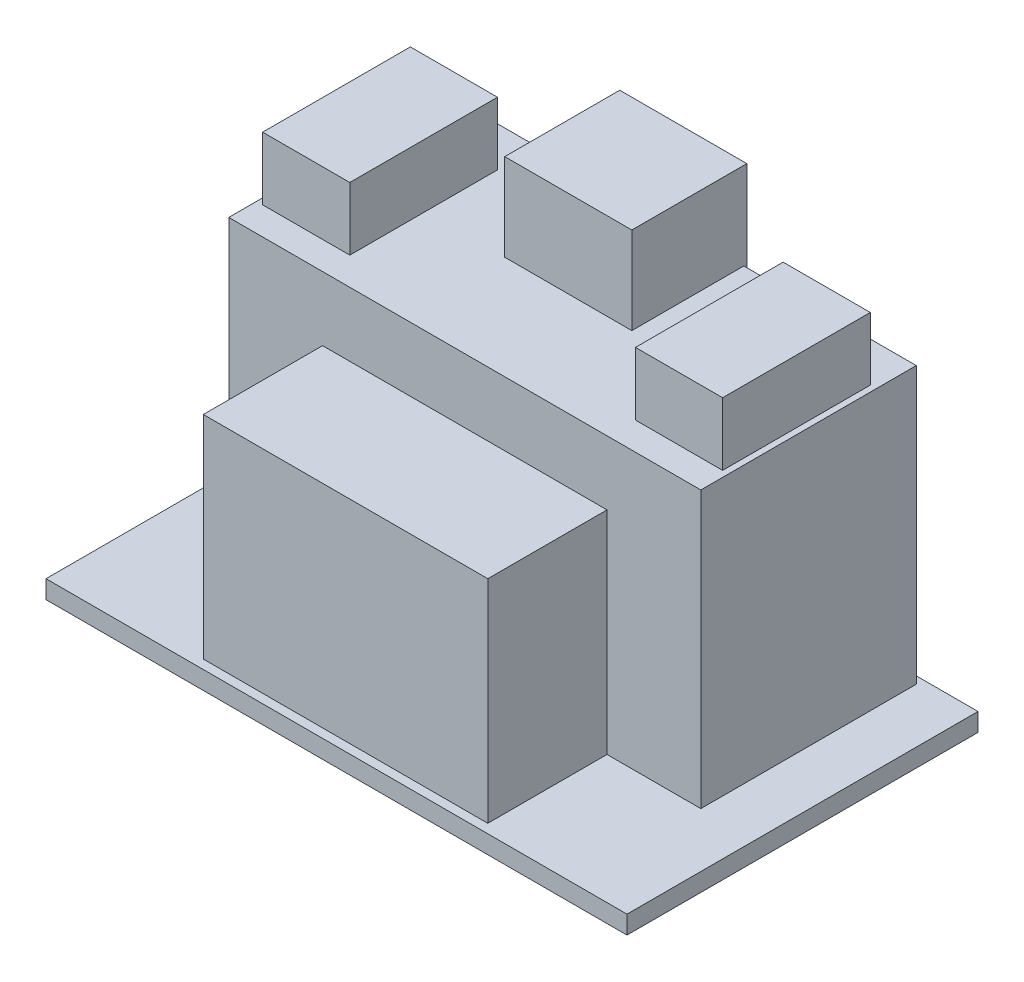
ISO-10303-21;
HEADER;
FILE_DESCRIPTION(('STEP AP214'),'2;1');
FILE_NAME('part.step','',(''),(''),'','','');
FILE_SCHEMA(('AUTOMOTIVE_DESIGN { 1 0 10303 214 1 1 1 1 }'));
ENDSEC;
DATA;
#1=APPLICATION_CONTEXT('core data for automotive mechanical design processes');
#2=APPLICATION_PROTOCOL_DEFINITION('international standard','automotive_design',2000,#1);
#3=PRODUCT_CONTEXT('',#1,'mechanical');
#4=PRODUCT('Part','Part','',(#3));
#5=PRODUCT_RELATED_PRODUCT_CATEGORY('part','',(#4));
#6=PRODUCT_DEFINITION_FORMATION('','',#4);
#7=PRODUCT_DEFINITION_CONTEXT('part definition',#1,'design');
#8=PRODUCT_DEFINITION('design','',#6,#7);
#9=PRODUCT_DEFINITION_SHAPE('','',#8);
#10=(LENGTH_UNIT() NAMED_UNIT(*) SI_UNIT(.MILLI.,.METRE.));
#11=(NAMED_UNIT(*) PLANE_ANGLE_UNIT() SI_UNIT($,.RADIAN.));
#12=(NAMED_UNIT(*) SI_UNIT($,.STERADIAN.) SOLID_ANGLE_UNIT());
#13=UNCERTAINTY_MEASURE_WITH_UNIT(LENGTH_MEASURE(1.E-05),#10,'distance_accuracy_value','');
#14=(GEOMETRIC_REPRESENTATION_CONTEXT(3) GLOBAL_UNCERTAINTY_ASSIGNED_CONTEXT((#13)) GLOBAL_UNIT_ASSIGNED_CONTEXT((#10,
#11,#12)) REPRESENTATION_CONTEXT('',''));
#15=CARTESIAN_POINT('',(0.,0.,0.));
#16=DIRECTION('',(0.,0.,1.));
#17=DIRECTION('',(1.,0.,0.));
#18=AXIS2_PLACEMENT_3D('',#15,#16,#17);
#19=CARTESIAN_POINT('',(0.,228.,0.));
#20=DIRECTION('',(0.,-1.,0.));
#21=DIRECTION('',(0.,0.,-1.));
#22=AXIS2_PLACEMENT_3D('',#19,#20,#21);
#23=PLANE('',#22);
#24=DIRECTION('',(0.,0.,-1.));
#25=VECTOR('',#24,1.);
#26=CARTESIAN_POINT('',(-118.,228.,0.));
#27=LINE('',#26,#25);
#28=CARTESIAN_POINT('',(-118.,228.,16.));
#29=VERTEX_POINT('',#28);
#30=CARTESIAN_POINT('',(-118.,228.,-106.));
#31=VERTEX_POINT('',#30);
#32=EDGE_CURVE('E411',#29,#31,#27,.T.);
#33=ORIENTED_EDGE('',*,*,#32,.F.);
#34=DIRECTION('',(1.,0.,0.));
#35=VECTOR('',#34,1.);
#36=CARTESIAN_POINT('',(0.,228.,16.));
#37=LINE('',#36,#35);
#38=CARTESIAN_POINT('',(-190.,228.,16.));
#39=VERTEX_POINT('',#38);
#40=EDGE_CURVE('E402',#39,#29,#37,.T.);
#41=ORIENTED_EDGE('',*,*,#40,.F.);
#42=DIRECTION('',(0.,0.,1.));
#43=VECTOR('',#42,1.);
#44=CARTESIAN_POINT('',(-190.,228.,0.));
#45=LINE('',#44,#43);
#46=CARTESIAN_POINT('',(-190.,228.,-106.));
#47=VERTEX_POINT('',#46);
#48=EDGE_CURVE('E405',#47,#39,#45,.T.);
#49=ORIENTED_EDGE('',*,*,#48,.F.);
#50=DIRECTION('',(-1.,0.,0.));
#51=VECTOR('',#50,1.);
#52=CARTESIAN_POINT('',(0.,228.,-106.));
#53=LINE('',#52,#51);
#54=EDGE_CURVE('E408',#31,#47,#53,.T.);
#55=ORIENTED_EDGE('',*,*,#54,.F.);
#56=EDGE_LOOP('',(#33,#41,#49,#55));
#57=FACE_BOUND('',#56,.T.);
#58=DIRECTION('',(0.,0.,-1.));
#59=VECTOR('',#58,1.);
#60=CARTESIAN_POINT('',(52.5,228.,0.));
#61=LINE('',#60,#59);
#62=CARTESIAN_POINT('',(52.5,228.,-46.5));
#63=VERTEX_POINT('',#62);
#64=CARTESIAN_POINT('',(52.5,228.,-139.));
#65=VERTEX_POINT('',#64);
#66=EDGE_CURVE('E399',#63,#65,#61,.T.);
#67=ORIENTED_EDGE('',*,*,#66,.F.);
#68=DIRECTION('',(1.,0.,0.));
#69=VECTOR('',#68,1.);
#70=CARTESIAN_POINT('',(0.,228.,-46.5));
#71=LINE('',#70,#69);
#72=CARTESIAN_POINT('',(-52.5,228.,-46.5));
#73=VERTEX_POINT('',#72);
#74=EDGE_CURVE('E393',#73,#63,#71,.T.);
#75=ORIENTED_EDGE('',*,*,#74,.F.);
#76=DIRECTION('',(0.,0.,1.));
#77=VECTOR('',#76,1.);
#78=CARTESIAN_POINT('',(-52.5,228.,0.));
#79=LINE('',#78,#77);
#80=CARTESIAN_POINT('',(-52.5,228.,-139.));
#81=VERTEX_POINT('',#80);
#82=EDGE_CURVE('E396',#81,#73,#79,.T.);
#83=ORIENTED_EDGE('',*,*,#82,.F.);
#84=DIRECTION('',(-1.,0.,0.));
#85=VECTOR('',#84,1.);
#86=CARTESIAN_POINT('',(-195.,228.,-139.));
#87=LINE('',#86,#85);
#88=CARTESIAN_POINT('',(-195.,228.,-139.));
#89=VERTEX_POINT('',#88);
#90=EDGE_CURVE('E319',#81,#89,#87,.T.);
#91=ORIENTED_EDGE('',*,*,#90,.T.);
#92=DIRECTION('',(0.,0.,1.));
#93=VECTOR('',#92,1.);
#94=CARTESIAN_POINT('',(-195.,228.,39.));
#95=LINE('',#94,#93);
#96=CARTESIAN_POINT('',(-195.,228.,39.));
#97=VERTEX_POINT('',#96);
#98=EDGE_CURVE('E324',#89,#97,#95,.T.);
#99=ORIENTED_EDGE('',*,*,#98,.T.);
#100=DIRECTION('',(1.,0.,0.));
#101=VECTOR('',#100,1.);
#102=CARTESIAN_POINT('',(-195.,228.,39.));
#103=LINE('',#102,#101);
#104=CARTESIAN_POINT('',(195.,228.,39.));
#105=VERTEX_POINT('',#104);
#106=EDGE_CURVE('E326',#97,#105,#103,.T.);
#107=ORIENTED_EDGE('',*,*,#106,.T.);
#108=DIRECTION('',(0.,0.,-1.));
#109=VECTOR('',#108,1.);
#110=CARTESIAN_POINT('',(195.,228.,39.));
#111=LINE('',#110,#109);
#112=CARTESIAN_POINT('',(195.,228.,-139.));
#113=VERTEX_POINT('',#112);
#114=EDGE_CURVE('E316',#105,#113,#111,.T.);
#115=ORIENTED_EDGE('',*,*,#114,.T.);
#116=EDGE_CURVE('E321',#113,#65,#87,.T.);
#117=ORIENTED_EDGE('',*,*,#116,.T.);
#118=EDGE_LOOP('',(#67,#75,#83,#91,#99,#107,#115,#117));
#119=FACE_BOUND('',#118,.T.);
#120=DIRECTION('',(0.,0.,-1.));
#121=VECTOR('',#120,1.);
#122=CARTESIAN_POINT('',(190.,228.,0.));
#123=LINE('',#122,#121);
#124=CARTESIAN_POINT('',(190.,228.,16.));
#125=VERTEX_POINT('',#124);
#126=CARTESIAN_POINT('',(190.,228.,-106.));
#127=VERTEX_POINT('',#126);
#128=EDGE_CURVE('E11',#125,#127,#123,.T.);
#129=ORIENTED_EDGE('',*,*,#128,.F.);
#130=DIRECTION('',(1.,0.,0.));
#131=VECTOR('',#130,1.);
#132=CARTESIAN_POINT('',(0.,228.,16.));
#133=LINE('',#132,#131);
#134=CARTESIAN_POINT('',(118.,228.,16.));
#135=VERTEX_POINT('',#134);
#136=EDGE_CURVE('E414',#135,#125,#133,.T.);
#137=ORIENTED_EDGE('',*,*,#136,.F.);
#138=DIRECTION('',(0.,0.,1.));
#139=VECTOR('',#138,1.);
#140=CARTESIAN_POINT('',(118.,228.,0.));
#141=LINE('',#140,#139);
#142=CARTESIAN_POINT('',(118.,228.,-106.));
#143=VERTEX_POINT('',#142);
#144=EDGE_CURVE('E59',#143,#135,#141,.T.);
#145=ORIENTED_EDGE('',*,*,#144,.F.);
#146=DIRECTION('',(-1.,0.,0.));
#147=VECTOR('',#146,1.);
#148=CARTESIAN_POINT('',(0.,228.,-106.));
#149=LINE('',#148,#147);
#150=EDGE_CURVE('E49',#127,#143,#149,.T.);
#151=ORIENTED_EDGE('',*,*,#150,.F.);
#152=EDGE_LOOP('',(#129,#137,#145,#151));
#153=FACE_BOUND('',#152,.T.);
#154=ADVANCED_FACE('F41',(#57,#119,#153),#23,.F.);
#155=CARTESIAN_POINT('',(0.,0.,0.));
#156=DIRECTION('',(0.,-1.,0.));
#157=DIRECTION('',(0.,0.,-1.));
#158=AXIS2_PLACEMENT_3D('',#155,#156,#157);
#159=PLANE('',#158);
#160=DIRECTION('',(0.,0.,-1.));
#161=VECTOR('',#160,1.);
#162=CARTESIAN_POINT('',(240.,0.,145.));
#163=LINE('',#162,#161);
#164=CARTESIAN_POINT('',(240.,0.,145.));
#165=VERTEX_POINT('',#164);
#166=CARTESIAN_POINT('',(240.,0.,-145.));
#167=VERTEX_POINT('',#166);
#168=EDGE_CURVE('E352',#165,#167,#163,.T.);
#169=ORIENTED_EDGE('',*,*,#168,.T.);
#170=DIRECTION('',(-1.,0.,0.));
#171=VECTOR('',#170,1.);
#172=CARTESIAN_POINT('',(-240.,0.,-145.));
#173=LINE('',#172,#171);
#174=CARTESIAN_POINT('',(-240.,0.,-145.));
#175=VERTEX_POINT('',#174);
#176=EDGE_CURVE('E369',#167,#175,#173,.T.);
#177=ORIENTED_EDGE('',*,*,#176,.T.);
#178=DIRECTION('',(0.,0.,1.));
#179=VECTOR('',#178,1.);
#180=CARTESIAN_POINT('',(-240.,0.,145.));
#181=LINE('',#180,#179);
#182=CARTESIAN_POINT('',(-240.,0.,145.));
#183=VERTEX_POINT('',#182);
#184=EDGE_CURVE('E372',#175,#183,#181,.T.);
#185=ORIENTED_EDGE('',*,*,#184,.T.);
#186=DIRECTION('',(1.,0.,0.));
#187=VECTOR('',#186,1.);
#188=CARTESIAN_POINT('',(-240.,0.,145.));
#189=LINE('',#188,#187);
#190=EDGE_CURVE('E357',#183,#165,#189,.T.);
#191=ORIENTED_EDGE('',*,*,#190,.T.);
#192=EDGE_LOOP('',(#169,#177,#185,#191));
#193=FACE_BOUND('',#192,.T.);
#194=DIRECTION('',(0.,0.,-1.));
#195=VECTOR('',#194,1.);
#196=CARTESIAN_POINT('',(52.5,0.,-46.5));
#197=LINE('',#196,#195);
#198=CARTESIAN_POINT('',(52.5,0.,-139.));
#199=VERTEX_POINT('',#198);
#200=CARTESIAN_POINT('',(52.5,0.,-141.5));
#201=VERTEX_POINT('',#200);
#202=EDGE_CURVE('E257',#199,#201,#197,.T.);
#203=ORIENTED_EDGE('',*,*,#202,.F.);
#204=DIRECTION('',(-1.,0.,0.));
#205=VECTOR('',#204,1.);
#206=CARTESIAN_POINT('',(-195.,0.,-139.));
#207=LINE('',#206,#205);
#208=CARTESIAN_POINT('',(195.,0.,-139.));
#209=VERTEX_POINT('',#208);
#210=EDGE_CURVE('E332',#209,#199,#207,.T.);
#211=ORIENTED_EDGE('',*,*,#210,.F.);
#212=DIRECTION('',(0.,0.,-1.));
#213=VECTOR('',#212,1.);
#214=CARTESIAN_POINT('',(195.,0.,39.));
#215=LINE('',#214,#213);
#216=CARTESIAN_POINT('',(195.,0.,39.));
#217=VERTEX_POINT('',#216);
#218=EDGE_CURVE('E315',#217,#209,#215,.T.);
#219=ORIENTED_EDGE('',*,*,#218,.F.);
#220=DIRECTION('',(1.,0.,0.));
#221=VECTOR('',#220,1.);
#222=CARTESIAN_POINT('',(-195.,0.,39.));
#223=LINE('',#222,#221);
#224=CARTESIAN_POINT('',(117.5,0.,39.));
#225=VERTEX_POINT('',#224);
#226=EDGE_CURVE('E338',#225,#217,#223,.T.);
#227=ORIENTED_EDGE('',*,*,#226,.F.);
#228=DIRECTION('',(0.,0.,-1.));
#229=VECTOR('',#228,1.);
#230=CARTESIAN_POINT('',(117.5,0.,137.5));
#231=LINE('',#230,#229);
#232=CARTESIAN_POINT('',(117.5,0.,137.5));
#233=VERTEX_POINT('',#232);
#234=EDGE_CURVE('E293',#233,#225,#231,.T.);
#235=ORIENTED_EDGE('',*,*,#234,.F.);
#236=DIRECTION('',(1.,0.,0.));
#237=VECTOR('',#236,1.);
#238=CARTESIAN_POINT('',(-117.5,0.,137.5));
#239=LINE('',#238,#237);
#240=CARTESIAN_POINT('',(-117.5,0.,137.5));
#241=VERTEX_POINT('',#240);
#242=EDGE_CURVE('E298',#241,#233,#239,.T.);
#243=ORIENTED_EDGE('',*,*,#242,.F.);
#244=DIRECTION('',(0.,0.,1.));
#245=VECTOR('',#244,1.);
#246=CARTESIAN_POINT('',(-117.5,0.,137.5));
#247=LINE('',#246,#245);
#248=CARTESIAN_POINT('',(-117.5,0.,39.));
#249=VERTEX_POINT('',#248);
#250=EDGE_CURVE('E305',#249,#241,#247,.T.);
#251=ORIENTED_EDGE('',*,*,#250,.F.);
#252=CARTESIAN_POINT('',(-195.,0.,39.));
#253=VERTEX_POINT('',#252);
#254=EDGE_CURVE('E320',#253,#249,#223,.T.);
#255=ORIENTED_EDGE('',*,*,#254,.F.);
#256=DIRECTION('',(0.,0.,1.));
#257=VECTOR('',#256,1.);
#258=CARTESIAN_POINT('',(-195.,0.,39.));
#259=LINE('',#258,#257);
#260=CARTESIAN_POINT('',(-195.,0.,-139.));
#261=VERTEX_POINT('',#260);
#262=EDGE_CURVE('E335',#261,#253,#259,.T.);
#263=ORIENTED_EDGE('',*,*,#262,.F.);
#264=CARTESIAN_POINT('',(-52.5,0.,-139.));
#265=VERTEX_POINT('',#264);
#266=EDGE_CURVE('E331',#265,#261,#207,.T.);
#267=ORIENTED_EDGE('',*,*,#266,.F.);
#268=DIRECTION('',(0.,0.,1.));
#269=VECTOR('',#268,1.);
#270=CARTESIAN_POINT('',(-52.5,0.,-46.5));
#271=LINE('',#270,#269);
#272=CARTESIAN_POINT('',(-52.5,0.,-141.5));
#273=VERTEX_POINT('',#272);
#274=EDGE_CURVE('E262',#273,#265,#271,.T.);
#275=ORIENTED_EDGE('',*,*,#274,.F.);
#276=DIRECTION('',(-1.,0.,0.));
#277=VECTOR('',#276,1.);
#278=CARTESIAN_POINT('',(-52.5,0.,-141.5));
#279=LINE('',#278,#277);
#280=EDGE_CURVE('E271',#201,#273,#279,.T.);
#281=ORIENTED_EDGE('',*,*,#280,.F.);
#282=EDGE_LOOP('',(#203,#211,#219,#227,#235,#243,#251,#255,#263,#267,#275,#281));
#283=FACE_BOUND('',#282,.T.);
#284=ADVANCED_FACE('F428',(#193,#283),#159,.F.);
#285=CARTESIAN_POINT('',(-195.,228.,-139.));
#286=DIRECTION('',(0.,0.,1.));
#287=DIRECTION('',(1.,0.,0.));
#288=AXIS2_PLACEMENT_3D('',#285,#286,#287);
#289=PLANE('',#288);
#290=DIRECTION('',(0.,-1.,0.));
#291=VECTOR('',#290,1.);
#292=CARTESIAN_POINT('',(52.5,228.,-139.));
#293=LINE('',#292,#291);
#294=EDGE_CURVE('E290',#65,#199,#293,.T.);
#295=ORIENTED_EDGE('',*,*,#294,.F.);
#296=ORIENTED_EDGE('',*,*,#116,.F.);
#297=DIRECTION('',(0.,-1.,0.));
#298=VECTOR('',#297,1.);
#299=CARTESIAN_POINT('',(195.,228.,-139.));
#300=LINE('',#299,#298);
#301=EDGE_CURVE('E349',#113,#209,#300,.T.);
#302=ORIENTED_EDGE('',*,*,#301,.T.);
#303=ORIENTED_EDGE('',*,*,#210,.T.);
#304=EDGE_LOOP('',(#295,#296,#302,#303));
#305=FACE_BOUND('',#304,.T.);
#306=ADVANCED_FACE('F436',(#305),#289,.F.);
#307=DIRECTION('',(0.,1.,0.));
#308=VECTOR('',#307,1.);
#309=CARTESIAN_POINT('',(-52.5,228.,-139.));
#310=LINE('',#309,#308);
#311=EDGE_CURVE('E287',#265,#81,#310,.T.);
#312=ORIENTED_EDGE('',*,*,#311,.F.);
#313=ORIENTED_EDGE('',*,*,#266,.T.);
#314=DIRECTION('',(0.,-1.,0.));
#315=VECTOR('',#314,1.);
#316=CARTESIAN_POINT('',(-195.,228.,-139.));
#317=LINE('',#316,#315);
#318=EDGE_CURVE('E346',#89,#261,#317,.T.);
#319=ORIENTED_EDGE('',*,*,#318,.F.);
#320=ORIENTED_EDGE('',*,*,#90,.F.);
#321=EDGE_LOOP('',(#312,#313,#319,#320));
#322=FACE_BOUND('',#321,.T.);
#323=ADVANCED_FACE('F447',(#322),#289,.F.);
#324=CARTESIAN_POINT('',(-195.,228.,39.));
#325=DIRECTION('',(0.,0.,-1.));
#326=DIRECTION('',(-1.,0.,0.));
#327=AXIS2_PLACEMENT_3D('',#324,#325,#326);
#328=PLANE('',#327);
#329=DIRECTION('',(0.,1.,0.));
#330=VECTOR('',#329,1.);
#331=CARTESIAN_POINT('',(117.5,228.,39.));
#332=LINE('',#331,#330);
#333=CARTESIAN_POINT('',(117.5,175.,39.));
#334=VERTEX_POINT('',#333);
#335=EDGE_CURVE('E390',#225,#334,#332,.T.);
#336=ORIENTED_EDGE('',*,*,#335,.F.);
#337=ORIENTED_EDGE('',*,*,#226,.T.);
#338=DIRECTION('',(0.,-1.,0.));
#339=VECTOR('',#338,1.);
#340=CARTESIAN_POINT('',(195.,228.,39.));
#341=LINE('',#340,#339);
#342=EDGE_CURVE('E328',#105,#217,#341,.T.);
#343=ORIENTED_EDGE('',*,*,#342,.F.);
#344=ORIENTED_EDGE('',*,*,#106,.F.);
#345=DIRECTION('',(0.,-1.,0.));
#346=VECTOR('',#345,1.);
#347=CARTESIAN_POINT('',(-195.,228.,39.));
#348=LINE('',#347,#346);
#349=EDGE_CURVE('E343',#97,#253,#348,.T.);
#350=ORIENTED_EDGE('',*,*,#349,.T.);
#351=ORIENTED_EDGE('',*,*,#254,.T.);
#352=DIRECTION('',(0.,-1.,0.));
#353=VECTOR('',#352,1.);
#354=CARTESIAN_POINT('',(-117.5,228.,39.));
#355=LINE('',#354,#353);
#356=CARTESIAN_POINT('',(-117.5,175.,39.));
#357=VERTEX_POINT('',#356);
#358=EDGE_CURVE('E387',#357,#249,#355,.T.);
#359=ORIENTED_EDGE('',*,*,#358,.F.);
#360=DIRECTION('',(-1.,0.,0.));
#361=VECTOR('',#360,1.);
#362=CARTESIAN_POINT('',(-195.,175.,39.));
#363=LINE('',#362,#361);
#364=EDGE_CURVE('E379',#334,#357,#363,.T.);
#365=ORIENTED_EDGE('',*,*,#364,.F.);
#366=EDGE_LOOP('',(#336,#337,#343,#344,#350,#351,#359,#365));
#367=FACE_BOUND('',#366,.T.);
#368=ADVANCED_FACE('F444',(#367),#328,.F.);
#369=CARTESIAN_POINT('',(240.,-15.,145.));
#370=DIRECTION('',(1.,0.,0.));
#371=DIRECTION('',(0.,0.,-1.));
#372=AXIS2_PLACEMENT_3D('',#369,#370,#371);
#373=PLANE('',#372);
#374=ORIENTED_EDGE('',*,*,#168,.F.);
#375=DIRECTION('',(0.,1.,0.));
#376=VECTOR('',#375,1.);
#377=CARTESIAN_POINT('',(240.,-15.,145.));
#378=LINE('',#377,#376);
#379=CARTESIAN_POINT('',(240.,-15.,145.));
#380=VERTEX_POINT('',#379);
#381=EDGE_CURVE('E377',#380,#165,#378,.T.);
#382=ORIENTED_EDGE('',*,*,#381,.F.);
#383=DIRECTION('',(0.,0.,-1.));
#384=VECTOR('',#383,1.);
#385=CARTESIAN_POINT('',(240.,-15.,145.));
#386=LINE('',#385,#384);
#387=CARTESIAN_POINT('',(240.,-15.,-145.));
#388=VERTEX_POINT('',#387);
#389=EDGE_CURVE('E353',#380,#388,#386,.T.);
#390=ORIENTED_EDGE('',*,*,#389,.T.);
#391=DIRECTION('',(0.,1.,0.));
#392=VECTOR('',#391,1.);
#393=CARTESIAN_POINT('',(240.,-15.,-145.));
#394=LINE('',#393,#392);
#395=EDGE_CURVE('E366',#388,#167,#394,.T.);
#396=ORIENTED_EDGE('',*,*,#395,.T.);
#397=EDGE_LOOP('',(#374,#382,#390,#396));
#398=FACE_BOUND('',#397,.T.);
#399=ADVANCED_FACE('F43',(#398),#373,.T.);
#400=CARTESIAN_POINT('',(-240.,-15.,145.));
#401=DIRECTION('',(0.,0.,1.));
#402=DIRECTION('',(1.,0.,0.));
#403=AXIS2_PLACEMENT_3D('',#400,#401,#402);
#404=PLANE('',#403);
#405=ORIENTED_EDGE('',*,*,#190,.F.);
#406=DIRECTION('',(0.,1.,0.));
#407=VECTOR('',#406,1.);
#408=CARTESIAN_POINT('',(-240.,-15.,145.));
#409=LINE('',#408,#407);
#410=CARTESIAN_POINT('',(-240.,-15.,145.));
#411=VERTEX_POINT('',#410);
#412=EDGE_CURVE('E380',#411,#183,#409,.T.);
#413=ORIENTED_EDGE('',*,*,#412,.F.);
#414=DIRECTION('',(1.,0.,0.));
#415=VECTOR('',#414,1.);
#416=CARTESIAN_POINT('',(-240.,-15.,145.));
#417=LINE('',#416,#415);
#418=EDGE_CURVE('E363',#411,#380,#417,.T.);
#419=ORIENTED_EDGE('',*,*,#418,.T.);
#420=ORIENTED_EDGE('',*,*,#381,.T.);
#421=EDGE_LOOP('',(#405,#413,#419,#420));
#422=FACE_BOUND('',#421,.T.);
#423=ADVANCED_FACE('F465',(#422),#404,.T.);
#424=CARTESIAN_POINT('',(-240.,-15.,145.));
#425=DIRECTION('',(-1.,0.,0.));
#426=DIRECTION('',(0.,0.,1.));
#427=AXIS2_PLACEMENT_3D('',#424,#425,#426);
#428=PLANE('',#427);
#429=ORIENTED_EDGE('',*,*,#184,.F.);
#430=DIRECTION('',(0.,1.,0.));
#431=VECTOR('',#430,1.);
#432=CARTESIAN_POINT('',(-240.,-15.,-145.));
#433=LINE('',#432,#431);
#434=CARTESIAN_POINT('',(-240.,-15.,-145.));
#435=VERTEX_POINT('',#434);
#436=EDGE_CURVE('E382',#435,#175,#433,.T.);
#437=ORIENTED_EDGE('',*,*,#436,.F.);
#438=DIRECTION('',(0.,0.,1.));
#439=VECTOR('',#438,1.);
#440=CARTESIAN_POINT('',(-240.,-15.,145.));
#441=LINE('',#440,#439);
#442=EDGE_CURVE('E360',#435,#411,#441,.T.);
#443=ORIENTED_EDGE('',*,*,#442,.T.);
#444=ORIENTED_EDGE('',*,*,#412,.T.);
#445=EDGE_LOOP('',(#429,#437,#443,#444));
#446=FACE_BOUND('',#445,.T.);
#447=ADVANCED_FACE('F468',(#446),#428,.T.);
#448=CARTESIAN_POINT('',(-240.,-15.,-145.));
#449=DIRECTION('',(0.,0.,-1.));
#450=DIRECTION('',(-1.,0.,0.));
#451=AXIS2_PLACEMENT_3D('',#448,#449,#450);
#452=PLANE('',#451);
#453=ORIENTED_EDGE('',*,*,#176,.F.);
#454=ORIENTED_EDGE('',*,*,#395,.F.);
#455=DIRECTION('',(-1.,0.,0.));
#456=VECTOR('',#455,1.);
#457=CARTESIAN_POINT('',(-240.,-15.,-145.));
#458=LINE('',#457,#456);
#459=EDGE_CURVE('E356',#388,#435,#458,.T.);
#460=ORIENTED_EDGE('',*,*,#459,.T.);
#461=ORIENTED_EDGE('',*,*,#436,.T.);
#462=EDGE_LOOP('',(#453,#454,#460,#461));
#463=FACE_BOUND('',#462,.T.);
#464=ADVANCED_FACE('F462',(#463),#452,.T.);
#465=CARTESIAN_POINT('',(0.,-15.,0.));
#466=DIRECTION('',(0.,-1.,0.));
#467=DIRECTION('',(0.,0.,-1.));
#468=AXIS2_PLACEMENT_3D('',#465,#466,#467);
#469=PLANE('',#468);
#470=ORIENTED_EDGE('',*,*,#389,.F.);
#471=ORIENTED_EDGE('',*,*,#418,.F.);
#472=ORIENTED_EDGE('',*,*,#442,.F.);
#473=ORIENTED_EDGE('',*,*,#459,.F.);
#474=EDGE_LOOP('',(#470,#471,#472,#473));
#475=FACE_BOUND('',#474,.T.);
#476=ADVANCED_FACE('F459',(#475),#469,.T.);
#477=CARTESIAN_POINT('',(195.,228.,39.));
#478=DIRECTION('',(-1.,0.,0.));
#479=DIRECTION('',(0.,0.,1.));
#480=AXIS2_PLACEMENT_3D('',#477,#478,#479);
#481=PLANE('',#480);
#482=ORIENTED_EDGE('',*,*,#218,.T.);
#483=ORIENTED_EDGE('',*,*,#301,.F.);
#484=ORIENTED_EDGE('',*,*,#114,.F.);
#485=ORIENTED_EDGE('',*,*,#342,.T.);
#486=EDGE_LOOP('',(#482,#483,#484,#485));
#487=FACE_BOUND('',#486,.T.);
#488=ADVANCED_FACE('F452',(#487),#481,.F.);
#489=CARTESIAN_POINT('',(-195.,228.,39.));
#490=DIRECTION('',(1.,0.,0.));
#491=DIRECTION('',(0.,0.,-1.));
#492=AXIS2_PLACEMENT_3D('',#489,#490,#491);
#493=PLANE('',#492);
#494=ORIENTED_EDGE('',*,*,#262,.T.);
#495=ORIENTED_EDGE('',*,*,#349,.F.);
#496=ORIENTED_EDGE('',*,*,#98,.F.);
#497=ORIENTED_EDGE('',*,*,#318,.T.);
#498=EDGE_LOOP('',(#494,#495,#496,#497));
#499=FACE_BOUND('',#498,.T.);
#500=ADVANCED_FACE('F449',(#499),#493,.F.);
#501=CARTESIAN_POINT('',(117.5,175.,137.5));
#502=DIRECTION('',(-1.,0.,0.));
#503=DIRECTION('',(0.,0.,1.));
#504=AXIS2_PLACEMENT_3D('',#501,#502,#503);
#505=PLANE('',#504);
#506=ORIENTED_EDGE('',*,*,#234,.T.);
#507=ORIENTED_EDGE('',*,*,#335,.T.);
#508=DIRECTION('',(0.,0.,-1.));
#509=VECTOR('',#508,1.);
#510=CARTESIAN_POINT('',(117.5,175.,137.5));
#511=LINE('',#510,#509);
#512=CARTESIAN_POINT('',(117.5,175.,137.5));
#513=VERTEX_POINT('',#512);
#514=EDGE_CURVE('E294',#513,#334,#511,.T.);
#515=ORIENTED_EDGE('',*,*,#514,.F.);
#516=DIRECTION('',(0.,-1.,0.));
#517=VECTOR('',#516,1.);
#518=CARTESIAN_POINT('',(117.5,175.,137.5));
#519=LINE('',#518,#517);
#520=EDGE_CURVE('E302',#513,#233,#519,.T.);
#521=ORIENTED_EDGE('',*,*,#520,.T.);
#522=EDGE_LOOP('',(#506,#507,#515,#521));
#523=FACE_BOUND('',#522,.T.);
#524=ADVANCED_FACE('F442',(#523),#505,.F.);
#525=CARTESIAN_POINT('',(-117.5,175.,137.5));
#526=DIRECTION('',(1.,0.,0.));
#527=DIRECTION('',(0.,0.,-1.));
#528=AXIS2_PLACEMENT_3D('',#525,#526,#527);
#529=PLANE('',#528);
#530=DIRECTION('',(0.,0.,1.));
#531=VECTOR('',#530,1.);
#532=CARTESIAN_POINT('',(-117.5,175.,137.5));
#533=LINE('',#532,#531);
#534=CARTESIAN_POINT('',(-117.5,175.,137.5));
#535=VERTEX_POINT('',#534);
#536=EDGE_CURVE('E297',#357,#535,#533,.T.);
#537=ORIENTED_EDGE('',*,*,#536,.F.);
#538=ORIENTED_EDGE('',*,*,#358,.T.);
#539=ORIENTED_EDGE('',*,*,#250,.T.);
#540=DIRECTION('',(0.,-1.,0.));
#541=VECTOR('',#540,1.);
#542=CARTESIAN_POINT('',(-117.5,175.,137.5));
#543=LINE('',#542,#541);
#544=EDGE_CURVE('E312',#535,#241,#543,.T.);
#545=ORIENTED_EDGE('',*,*,#544,.F.);
#546=EDGE_LOOP('',(#537,#538,#539,#545));
#547=FACE_BOUND('',#546,.T.);
#548=ADVANCED_FACE('F536',(#547),#529,.F.);
#549=CARTESIAN_POINT('',(0.,175.,0.));
#550=DIRECTION('',(0.,-1.,0.));
#551=DIRECTION('',(0.,0.,-1.));
#552=AXIS2_PLACEMENT_3D('',#549,#550,#551);
#553=PLANE('',#552);
#554=ORIENTED_EDGE('',*,*,#514,.T.);
#555=ORIENTED_EDGE('',*,*,#364,.T.);
#556=ORIENTED_EDGE('',*,*,#536,.T.);
#557=DIRECTION('',(1.,0.,0.));
#558=VECTOR('',#557,1.);
#559=CARTESIAN_POINT('',(-117.5,175.,137.5));
#560=LINE('',#559,#558);
#561=EDGE_CURVE('E300',#535,#513,#560,.T.);
#562=ORIENTED_EDGE('',*,*,#561,.T.);
#563=EDGE_LOOP('',(#554,#555,#556,#562));
#564=FACE_BOUND('',#563,.T.);
#565=ADVANCED_FACE('F545',(#564),#553,.F.);
#566=CARTESIAN_POINT('',(-117.5,175.,137.5));
#567=DIRECTION('',(0.,0.,-1.));
#568=DIRECTION('',(-1.,0.,0.));
#569=AXIS2_PLACEMENT_3D('',#566,#567,#568);
#570=PLANE('',#569);
#571=ORIENTED_EDGE('',*,*,#242,.T.);
#572=ORIENTED_EDGE('',*,*,#520,.F.);
#573=ORIENTED_EDGE('',*,*,#561,.F.);
#574=ORIENTED_EDGE('',*,*,#544,.T.);
#575=EDGE_LOOP('',(#571,#572,#573,#574));
#576=FACE_BOUND('',#575,.T.);
#577=ADVANCED_FACE('F554',(#576),#570,.F.);
#578=CARTESIAN_POINT('',(52.5,300.,-46.5));
#579=DIRECTION('',(-1.,0.,0.));
#580=DIRECTION('',(0.,0.,1.));
#581=AXIS2_PLACEMENT_3D('',#578,#579,#580);
#582=PLANE('',#581);
#583=ORIENTED_EDGE('',*,*,#66,.T.);
#584=ORIENTED_EDGE('',*,*,#294,.T.);
#585=ORIENTED_EDGE('',*,*,#202,.T.);
#586=DIRECTION('',(0.,-1.,0.));
#587=VECTOR('',#586,1.);
#588=CARTESIAN_POINT('',(52.5,300.,-141.5));
#589=LINE('',#588,#587);
#590=CARTESIAN_POINT('',(52.5,300.,-141.5));
#591=VERTEX_POINT('',#590);
#592=EDGE_CURVE('E284',#591,#201,#589,.T.);
#593=ORIENTED_EDGE('',*,*,#592,.F.);
#594=DIRECTION('',(0.,0.,-1.));
#595=VECTOR('',#594,1.);
#596=CARTESIAN_POINT('',(52.5,300.,-46.5));
#597=LINE('',#596,#595);
#598=CARTESIAN_POINT('',(52.5,300.,-46.5));
#599=VERTEX_POINT('',#598);
#600=EDGE_CURVE('E258',#599,#591,#597,.T.);
#601=ORIENTED_EDGE('',*,*,#600,.F.);
#602=DIRECTION('',(0.,-1.,0.));
#603=VECTOR('',#602,1.);
#604=CARTESIAN_POINT('',(52.5,300.,-46.5));
#605=LINE('',#604,#603);
#606=EDGE_CURVE('E268',#599,#63,#605,.T.);
#607=ORIENTED_EDGE('',*,*,#606,.T.);
#608=EDGE_LOOP('',(#583,#584,#585,#593,#601,#607));
#609=FACE_BOUND('',#608,.T.);
#610=ADVANCED_FACE('F564',(#609),#582,.F.);
#611=CARTESIAN_POINT('',(-52.5,300.,-46.5));
#612=DIRECTION('',(1.,0.,0.));
#613=DIRECTION('',(0.,0.,-1.));
#614=AXIS2_PLACEMENT_3D('',#611,#612,#613);
#615=PLANE('',#614);
#616=ORIENTED_EDGE('',*,*,#274,.T.);
#617=ORIENTED_EDGE('',*,*,#311,.T.);
#618=ORIENTED_EDGE('',*,*,#82,.T.);
#619=DIRECTION('',(0.,-1.,0.));
#620=VECTOR('',#619,1.);
#621=CARTESIAN_POINT('',(-52.5,300.,-46.5));
#622=LINE('',#621,#620);
#623=CARTESIAN_POINT('',(-52.5,300.,-46.5));
#624=VERTEX_POINT('',#623);
#625=EDGE_CURVE('E278',#624,#73,#622,.T.);
#626=ORIENTED_EDGE('',*,*,#625,.F.);
#627=DIRECTION('',(0.,0.,1.));
#628=VECTOR('',#627,1.);
#629=CARTESIAN_POINT('',(-52.5,300.,-46.5));
#630=LINE('',#629,#628);
#631=CARTESIAN_POINT('',(-52.5,300.,-141.5));
#632=VERTEX_POINT('',#631);
#633=EDGE_CURVE('E264',#632,#624,#630,.T.);
#634=ORIENTED_EDGE('',*,*,#633,.F.);
#635=DIRECTION('',(0.,-1.,0.));
#636=VECTOR('',#635,1.);
#637=CARTESIAN_POINT('',(-52.5,300.,-141.5));
#638=LINE('',#637,#636);
#639=EDGE_CURVE('E281',#632,#273,#638,.T.);
#640=ORIENTED_EDGE('',*,*,#639,.T.);
#641=EDGE_LOOP('',(#616,#617,#618,#626,#634,#640));
#642=FACE_BOUND('',#641,.T.);
#643=ADVANCED_FACE('F591',(#642),#615,.F.);
#644=CARTESIAN_POINT('',(-52.5,300.,-46.5));
#645=DIRECTION('',(0.,0.,-1.));
#646=DIRECTION('',(-1.,0.,0.));
#647=AXIS2_PLACEMENT_3D('',#644,#645,#646);
#648=PLANE('',#647);
#649=ORIENTED_EDGE('',*,*,#625,.T.);
#650=ORIENTED_EDGE('',*,*,#74,.T.);
#651=ORIENTED_EDGE('',*,*,#606,.F.);
#652=DIRECTION('',(1.,0.,0.));
#653=VECTOR('',#652,1.);
#654=CARTESIAN_POINT('',(-52.5,300.,-46.5));
#655=LINE('',#654,#653);
#656=EDGE_CURVE('E266',#624,#599,#655,.T.);
#657=ORIENTED_EDGE('',*,*,#656,.F.);
#658=EDGE_LOOP('',(#649,#650,#651,#657));
#659=FACE_BOUND('',#658,.T.);
#660=ADVANCED_FACE('F601',(#659),#648,.F.);
#661=CARTESIAN_POINT('',(-52.5,300.,-141.5));
#662=DIRECTION('',(0.,0.,1.));
#663=DIRECTION('',(1.,0.,0.));
#664=AXIS2_PLACEMENT_3D('',#661,#662,#663);
#665=PLANE('',#664);
#666=ORIENTED_EDGE('',*,*,#280,.T.);
#667=ORIENTED_EDGE('',*,*,#639,.F.);
#668=DIRECTION('',(-1.,0.,0.));
#669=VECTOR('',#668,1.);
#670=CARTESIAN_POINT('',(-52.5,300.,-141.5));
#671=LINE('',#670,#669);
#672=EDGE_CURVE('E261',#591,#632,#671,.T.);
#673=ORIENTED_EDGE('',*,*,#672,.F.);
#674=ORIENTED_EDGE('',*,*,#592,.T.);
#675=EDGE_LOOP('',(#666,#667,#673,#674));
#676=FACE_BOUND('',#675,.T.);
#677=ADVANCED_FACE('F611',(#676),#665,.F.);
#678=CARTESIAN_POINT('',(0.,300.,0.));
#679=DIRECTION('',(0.,-1.,0.));
#680=DIRECTION('',(0.,0.,-1.));
#681=AXIS2_PLACEMENT_3D('',#678,#679,#680);
#682=PLANE('',#681);
#683=ORIENTED_EDGE('',*,*,#600,.T.);
#684=ORIENTED_EDGE('',*,*,#672,.T.);
#685=ORIENTED_EDGE('',*,*,#633,.T.);
#686=ORIENTED_EDGE('',*,*,#656,.T.);
#687=EDGE_LOOP('',(#683,#684,#685,#686));
#688=FACE_BOUND('',#687,.T.);
#689=ADVANCED_FACE('F621',(#688),#682,.F.);
#690=CARTESIAN_POINT('',(-118.,280.,16.));
#691=DIRECTION('',(-1.,0.,0.));
#692=DIRECTION('',(0.,0.,1.));
#693=AXIS2_PLACEMENT_3D('',#690,#691,#692);
#694=PLANE('',#693);
#695=DIRECTION('',(0.,-1.,0.));
#696=VECTOR('',#695,1.);
#697=CARTESIAN_POINT('',(-118.,280.,16.));
#698=LINE('',#697,#696);
#699=CARTESIAN_POINT('',(-118.,280.,16.));
#700=VERTEX_POINT('',#699);
#701=EDGE_CURVE('E245',#700,#29,#698,.T.);
#702=ORIENTED_EDGE('',*,*,#701,.T.);
#703=ORIENTED_EDGE('',*,*,#32,.T.);
#704=DIRECTION('',(0.,-1.,0.));
#705=VECTOR('',#704,1.);
#706=CARTESIAN_POINT('',(-118.,280.,-106.));
#707=LINE('',#706,#705);
#708=CARTESIAN_POINT('',(-118.,280.,-106.));
#709=VERTEX_POINT('',#708);
#710=EDGE_CURVE('E254',#709,#31,#707,.T.);
#711=ORIENTED_EDGE('',*,*,#710,.F.);
#712=DIRECTION('',(0.,0.,-1.));
#713=VECTOR('',#712,1.);
#714=CARTESIAN_POINT('',(-118.,280.,16.));
#715=LINE('',#714,#713);
#716=EDGE_CURVE('E231',#700,#709,#715,.T.);
#717=ORIENTED_EDGE('',*,*,#716,.F.);
#718=EDGE_LOOP('',(#702,#703,#711,#717));
#719=FACE_BOUND('',#718,.T.);
#720=ADVANCED_FACE('F631',(#719),#694,.F.);
#721=CARTESIAN_POINT('',(-190.,280.,-106.));
#722=DIRECTION('',(0.,0.,1.));
#723=DIRECTION('',(1.,0.,0.));
#724=AXIS2_PLACEMENT_3D('',#721,#722,#723);
#725=PLANE('',#724);
#726=ORIENTED_EDGE('',*,*,#710,.T.);
#727=ORIENTED_EDGE('',*,*,#54,.T.);
#728=DIRECTION('',(0.,-1.,0.));
#729=VECTOR('',#728,1.);
#730=CARTESIAN_POINT('',(-190.,280.,-106.));
#731=LINE('',#730,#729);
#732=CARTESIAN_POINT('',(-190.,280.,-106.));
#733=VERTEX_POINT('',#732);
#734=EDGE_CURVE('E251',#733,#47,#731,.T.);
#735=ORIENTED_EDGE('',*,*,#734,.F.);
#736=DIRECTION('',(-1.,0.,0.));
#737=VECTOR('',#736,1.);
#738=CARTESIAN_POINT('',(-190.,280.,-106.));
#739=LINE('',#738,#737);
#740=EDGE_CURVE('E234',#709,#733,#739,.T.);
#741=ORIENTED_EDGE('',*,*,#740,.F.);
#742=EDGE_LOOP('',(#726,#727,#735,#741));
#743=FACE_BOUND('',#742,.T.);
#744=ADVANCED_FACE('F641',(#743),#725,.F.);
#745=CARTESIAN_POINT('',(-190.,280.,16.));
#746=DIRECTION('',(1.,0.,0.));
#747=DIRECTION('',(0.,0.,-1.));
#748=AXIS2_PLACEMENT_3D('',#745,#746,#747);
#749=PLANE('',#748);
#750=ORIENTED_EDGE('',*,*,#734,.T.);
#751=ORIENTED_EDGE('',*,*,#48,.T.);
#752=DIRECTION('',(0.,-1.,0.));
#753=VECTOR('',#752,1.);
#754=CARTESIAN_POINT('',(-190.,280.,16.));
#755=LINE('',#754,#753);
#756=CARTESIAN_POINT('',(-190.,280.,16.));
#757=VERTEX_POINT('',#756);
#758=EDGE_CURVE('E248',#757,#39,#755,.T.);
#759=ORIENTED_EDGE('',*,*,#758,.F.);
#760=DIRECTION('',(0.,0.,1.));
#761=VECTOR('',#760,1.);
#762=CARTESIAN_POINT('',(-190.,280.,16.));
#763=LINE('',#762,#761);
#764=EDGE_CURVE('E241',#733,#757,#763,.T.);
#765=ORIENTED_EDGE('',*,*,#764,.F.);
#766=EDGE_LOOP('',(#750,#751,#759,#765));
#767=FACE_BOUND('',#766,.T.);
#768=ADVANCED_FACE('F651',(#767),#749,.F.);
#769=CARTESIAN_POINT('',(-190.,280.,16.));
#770=DIRECTION('',(0.,0.,-1.));
#771=DIRECTION('',(-1.,0.,0.));
#772=AXIS2_PLACEMENT_3D('',#769,#770,#771);
#773=PLANE('',#772);
#774=ORIENTED_EDGE('',*,*,#758,.T.);
#775=ORIENTED_EDGE('',*,*,#40,.T.);
#776=ORIENTED_EDGE('',*,*,#701,.F.);
#777=DIRECTION('',(1.,0.,0.));
#778=VECTOR('',#777,1.);
#779=CARTESIAN_POINT('',(-190.,280.,16.));
#780=LINE('',#779,#778);
#781=EDGE_CURVE('E243',#757,#700,#780,.T.);
#782=ORIENTED_EDGE('',*,*,#781,.F.);
#783=EDGE_LOOP('',(#774,#775,#776,#782));
#784=FACE_BOUND('',#783,.T.);
#785=ADVANCED_FACE('F661',(#784),#773,.F.);
#786=CARTESIAN_POINT('',(0.,280.,0.));
#787=DIRECTION('',(0.,-1.,0.));
#788=DIRECTION('',(0.,0.,-1.));
#789=AXIS2_PLACEMENT_3D('',#786,#787,#788);
#790=PLANE('',#789);
#791=ORIENTED_EDGE('',*,*,#716,.T.);
#792=ORIENTED_EDGE('',*,*,#740,.T.);
#793=ORIENTED_EDGE('',*,*,#764,.T.);
#794=ORIENTED_EDGE('',*,*,#781,.T.);
#795=EDGE_LOOP('',(#791,#792,#793,#794));
#796=FACE_BOUND('',#795,.T.);
#797=ADVANCED_FACE('F671',(#796),#790,.F.);
#798=CARTESIAN_POINT('',(190.,280.,16.));
#799=DIRECTION('',(-1.,0.,0.));
#800=DIRECTION('',(0.,0.,1.));
#801=AXIS2_PLACEMENT_3D('',#798,#799,#800);
#802=PLANE('',#801);
#803=DIRECTION('',(0.,-1.,0.));
#804=VECTOR('',#803,1.);
#805=CARTESIAN_POINT('',(190.,280.,16.));
#806=LINE('',#805,#804);
#807=CARTESIAN_POINT('',(190.,280.,16.));
#808=VERTEX_POINT('',#807);
#809=EDGE_CURVE('E422',#808,#125,#806,.T.);
#810=ORIENTED_EDGE('',*,*,#809,.T.);
#811=ORIENTED_EDGE('',*,*,#128,.T.);
#812=DIRECTION('',(0.,-1.,0.));
#813=VECTOR('',#812,1.);
#814=CARTESIAN_POINT('',(190.,280.,-106.));
#815=LINE('',#814,#813);
#816=CARTESIAN_POINT('',(190.,280.,-106.));
#817=VERTEX_POINT('',#816);
#818=EDGE_CURVE('E214',#817,#127,#815,.T.);
#819=ORIENTED_EDGE('',*,*,#818,.F.);
#820=DIRECTION('',(0.,0.,-1.));
#821=VECTOR('',#820,1.);
#822=CARTESIAN_POINT('',(190.,280.,16.));
#823=LINE('',#822,#821);
#824=EDGE_CURVE('E220',#808,#817,#823,.T.);
#825=ORIENTED_EDGE('',*,*,#824,.F.);
#826=EDGE_LOOP('',(#810,#811,#819,#825));
#827=FACE_BOUND('',#826,.T.);
#828=ADVANCED_FACE('F230',(#827),#802,.F.);
#829=CARTESIAN_POINT('',(118.,280.,-106.));
#830=DIRECTION('',(0.,0.,1.));
#831=DIRECTION('',(1.,0.,0.));
#832=AXIS2_PLACEMENT_3D('',#829,#830,#831);
#833=PLANE('',#832);
#834=ORIENTED_EDGE('',*,*,#818,.T.);
#835=ORIENTED_EDGE('',*,*,#150,.T.);
#836=DIRECTION('',(0.,-1.,0.));
#837=VECTOR('',#836,1.);
#838=CARTESIAN_POINT('',(118.,280.,-106.));
#839=LINE('',#838,#837);
#840=CARTESIAN_POINT('',(118.,280.,-106.));
#841=VERTEX_POINT('',#840);
#842=EDGE_CURVE('E216',#841,#143,#839,.T.);
#843=ORIENTED_EDGE('',*,*,#842,.F.);
#844=DIRECTION('',(-1.,0.,0.));
#845=VECTOR('',#844,1.);
#846=CARTESIAN_POINT('',(118.,280.,-106.));
#847=LINE('',#846,#845);
#848=EDGE_CURVE('E210',#817,#841,#847,.T.);
#849=ORIENTED_EDGE('',*,*,#848,.F.);
#850=EDGE_LOOP('',(#834,#835,#843,#849));
#851=FACE_BOUND('',#850,.T.);
#852=ADVANCED_FACE('F212',(#851),#833,.F.);
#853=CARTESIAN_POINT('',(118.,280.,16.));
#854=DIRECTION('',(1.,0.,0.));
#855=DIRECTION('',(0.,0.,-1.));
#856=AXIS2_PLACEMENT_3D('',#853,#854,#855);
#857=PLANE('',#856);
#858=ORIENTED_EDGE('',*,*,#842,.T.);
#859=ORIENTED_EDGE('',*,*,#144,.T.);
#860=DIRECTION('',(0.,-1.,0.));
#861=VECTOR('',#860,1.);
#862=CARTESIAN_POINT('',(118.,280.,16.));
#863=LINE('',#862,#861);
#864=CARTESIAN_POINT('',(118.,280.,16.));
#865=VERTEX_POINT('',#864);
#866=EDGE_CURVE('E236',#865,#135,#863,.T.);
#867=ORIENTED_EDGE('',*,*,#866,.F.);
#868=DIRECTION('',(0.,0.,1.));
#869=VECTOR('',#868,1.);
#870=CARTESIAN_POINT('',(118.,280.,16.));
#871=LINE('',#870,#869);
#872=EDGE_CURVE('E219',#841,#865,#871,.T.);
#873=ORIENTED_EDGE('',*,*,#872,.F.);
#874=EDGE_LOOP('',(#858,#859,#867,#873));
#875=FACE_BOUND('',#874,.T.);
#876=ADVANCED_FACE('F418',(#875),#857,.F.);
#877=CARTESIAN_POINT('',(118.,280.,16.));
#878=DIRECTION('',(0.,0.,-1.));
#879=DIRECTION('',(-1.,0.,0.));
#880=AXIS2_PLACEMENT_3D('',#877,#878,#879);
#881=PLANE('',#880);
#882=ORIENTED_EDGE('',*,*,#866,.T.);
#883=ORIENTED_EDGE('',*,*,#136,.T.);
#884=ORIENTED_EDGE('',*,*,#809,.F.);
#885=DIRECTION('',(1.,0.,0.));
#886=VECTOR('',#885,1.);
#887=CARTESIAN_POINT('',(118.,280.,16.));
#888=LINE('',#887,#886);
#889=EDGE_CURVE('E225',#865,#808,#888,.T.);
#890=ORIENTED_EDGE('',*,*,#889,.F.);
#891=EDGE_LOOP('',(#882,#883,#884,#890));
#892=FACE_BOUND('',#891,.T.);
#893=ADVANCED_FACE('F426',(#892),#881,.F.);
#894=CARTESIAN_POINT('',(0.,280.,0.));
#895=DIRECTION('',(0.,-1.,0.));
#896=DIRECTION('',(0.,0.,-1.));
#897=AXIS2_PLACEMENT_3D('',#894,#895,#896);
#898=PLANE('',#897);
#899=ORIENTED_EDGE('',*,*,#824,.T.);
#900=ORIENTED_EDGE('',*,*,#848,.T.);
#901=ORIENTED_EDGE('',*,*,#872,.T.);
#902=ORIENTED_EDGE('',*,*,#889,.T.);
#903=EDGE_LOOP('',(#899,#900,#901,#902));
#904=FACE_BOUND('',#903,.T.);
#905=ADVANCED_FACE('F223',(#904),#898,.F.);
#906=CLOSED_SHELL('',(#154,#284,#306,#323,#368,#399,#423,#447,#464,#476,#488,#500,#524,#548,
#565,#577,#610,#643,#660,#677,#689,#720,#744,#768,#785,#797,#828,#852,#876,#893,#905));
#907=MANIFOLD_SOLID_BREP('B2',#906);
#908=ADVANCED_BREP_SHAPE_REPRESENTATION('',(#18,#907),#14);
#909=SHAPE_DEFINITION_REPRESENTATION(#9,#908);
ENDSEC;
END-ISO-10303-21;
